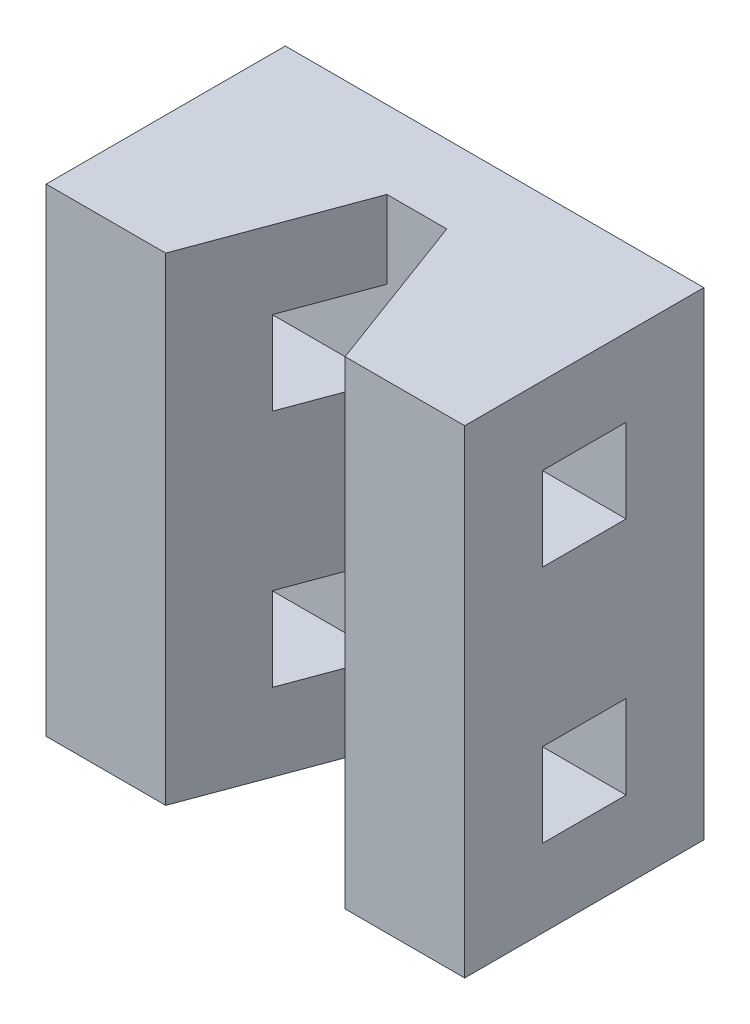
ISO-10303-21;
HEADER;
FILE_DESCRIPTION(('STEP AP214'),'2;1');
FILE_NAME('part.step','',(''),(''),'','','');
FILE_SCHEMA(('AUTOMOTIVE_DESIGN { 1 0 10303 214 1 1 1 1 }'));
ENDSEC;
DATA;
#1=APPLICATION_CONTEXT('core data for automotive mechanical design processes');
#2=APPLICATION_PROTOCOL_DEFINITION('international standard','automotive_design',2000,#1);
#3=PRODUCT_CONTEXT('',#1,'mechanical');
#4=PRODUCT('Part','Part','',(#3));
#5=PRODUCT_RELATED_PRODUCT_CATEGORY('part','',(#4));
#6=PRODUCT_DEFINITION_FORMATION('','',#4);
#7=PRODUCT_DEFINITION_CONTEXT('part definition',#1,'design');
#8=PRODUCT_DEFINITION('design','',#6,#7);
#9=PRODUCT_DEFINITION_SHAPE('','',#8);
#10=(LENGTH_UNIT() NAMED_UNIT(*) SI_UNIT(.MILLI.,.METRE.));
#11=(NAMED_UNIT(*) PLANE_ANGLE_UNIT() SI_UNIT($,.RADIAN.));
#12=(NAMED_UNIT(*) SI_UNIT($,.STERADIAN.) SOLID_ANGLE_UNIT());
#13=UNCERTAINTY_MEASURE_WITH_UNIT(LENGTH_MEASURE(1.E-05),#10,'distance_accuracy_value','');
#14=(GEOMETRIC_REPRESENTATION_CONTEXT(3) GLOBAL_UNCERTAINTY_ASSIGNED_CONTEXT((#13)) GLOBAL_UNIT_ASSIGNED_CONTEXT((#10,
#11,#12)) REPRESENTATION_CONTEXT('',''));
#15=CARTESIAN_POINT('',(0.,0.,0.));
#16=DIRECTION('',(0.,0.,1.));
#17=DIRECTION('',(1.,0.,0.));
#18=AXIS2_PLACEMENT_3D('',#15,#16,#17);
#19=CARTESIAN_POINT('',(-7.,8.,8.));
#20=DIRECTION('',(0.,-1.,0.));
#21=DIRECTION('',(0.,0.,-1.));
#22=AXIS2_PLACEMENT_3D('',#19,#20,#21);
#23=PLANE('',#22);
#24=DIRECTION('',(0.347314355823594,0.,0.937748760723704));
#25=VECTOR('',#24,1.);
#26=CARTESIAN_POINT('',(0.0325693606755091,8.,-0.0120627261761145));
#27=LINE('',#26,#25);
#28=CARTESIAN_POINT('',(0.999999999999997,8.,2.6));
#29=VERTEX_POINT('',#28);
#30=CARTESIAN_POINT('',(3.,8.,8.));
#31=VERTEX_POINT('',#30);
#32=EDGE_CURVE('E217',#29,#31,#27,.T.);
#33=ORIENTED_EDGE('',*,*,#32,.T.);
#34=DIRECTION('',(-1.,0.,0.));
#35=VECTOR('',#34,1.);
#36=CARTESIAN_POINT('',(-7.,8.,8.));
#37=LINE('',#36,#35);
#38=CARTESIAN_POINT('',(7.,8.,8.));
#39=VERTEX_POINT('',#38);
#40=EDGE_CURVE('E339',#39,#31,#37,.T.);
#41=ORIENTED_EDGE('',*,*,#40,.F.);
#42=DIRECTION('',(0.,0.,-1.));
#43=VECTOR('',#42,1.);
#44=CARTESIAN_POINT('',(7.,8.,8.));
#45=LINE('',#44,#43);
#46=CARTESIAN_POINT('',(7.,8.,0.));
#47=VERTEX_POINT('',#46);
#48=EDGE_CURVE('E363',#39,#47,#45,.T.);
#49=ORIENTED_EDGE('',*,*,#48,.T.);
#50=DIRECTION('',(-1.,0.,0.));
#51=VECTOR('',#50,1.);
#52=CARTESIAN_POINT('',(-7.,8.,0.));
#53=LINE('',#52,#51);
#54=CARTESIAN_POINT('',(-7.,8.,0.));
#55=VERTEX_POINT('',#54);
#56=EDGE_CURVE('E350',#47,#55,#53,.T.);
#57=ORIENTED_EDGE('',*,*,#56,.T.);
#58=DIRECTION('',(0.,0.,-1.));
#59=VECTOR('',#58,1.);
#60=CARTESIAN_POINT('',(-7.,8.,8.));
#61=LINE('',#60,#59);
#62=CARTESIAN_POINT('',(-7.,8.,8.));
#63=VERTEX_POINT('',#62);
#64=EDGE_CURVE('E360',#63,#55,#61,.T.);
#65=ORIENTED_EDGE('',*,*,#64,.F.);
#66=CARTESIAN_POINT('',(-3.,8.,8.));
#67=VERTEX_POINT('',#66);
#68=EDGE_CURVE('E337',#67,#63,#37,.T.);
#69=ORIENTED_EDGE('',*,*,#68,.F.);
#70=DIRECTION('',(-0.347314355823594,0.,0.937748760723704));
#71=VECTOR('',#70,1.);
#72=CARTESIAN_POINT('',(-0.0325693606755134,8.,-0.0120627261761161));
#73=LINE('',#72,#71);
#74=CARTESIAN_POINT('',(-1.,8.,2.6));
#75=VERTEX_POINT('',#74);
#76=EDGE_CURVE('E48',#75,#67,#73,.T.);
#77=ORIENTED_EDGE('',*,*,#76,.F.);
#78=DIRECTION('',(1.,0.,0.));
#79=VECTOR('',#78,1.);
#80=CARTESIAN_POINT('',(0.,8.,2.6));
#81=LINE('',#80,#79);
#82=EDGE_CURVE('E223',#75,#29,#81,.T.);
#83=ORIENTED_EDGE('',*,*,#82,.T.);
#84=EDGE_LOOP('',(#33,#41,#49,#57,#65,#69,#77,#83));
#85=FACE_BOUND('',#84,.T.);
#86=ADVANCED_FACE('F33',(#85),#23,.F.);
#87=CARTESIAN_POINT('',(-7.,-8.,8.));
#88=DIRECTION('',(0.,1.,0.));
#89=DIRECTION('',(0.,0.,1.));
#90=AXIS2_PLACEMENT_3D('',#87,#88,#89);
#91=PLANE('',#90);
#92=DIRECTION('',(0.347314355823594,0.,0.937748760723704));
#93=VECTOR('',#92,1.);
#94=CARTESIAN_POINT('',(0.0325693606755091,-8.,-0.0120627261761145));
#95=LINE('',#94,#93);
#96=CARTESIAN_POINT('',(0.999999999999997,-8.,2.6));
#97=VERTEX_POINT('',#96);
#98=CARTESIAN_POINT('',(3.,-8.,8.));
#99=VERTEX_POINT('',#98);
#100=EDGE_CURVE('E212',#97,#99,#95,.T.);
#101=ORIENTED_EDGE('',*,*,#100,.F.);
#102=DIRECTION('',(1.,0.,0.));
#103=VECTOR('',#102,1.);
#104=CARTESIAN_POINT('',(0.,-8.,2.6));
#105=LINE('',#104,#103);
#106=CARTESIAN_POINT('',(-1.,-8.,2.6));
#107=VERTEX_POINT('',#106);
#108=EDGE_CURVE('E197',#107,#97,#105,.T.);
#109=ORIENTED_EDGE('',*,*,#108,.F.);
#110=DIRECTION('',(-0.347314355823594,0.,0.937748760723704));
#111=VECTOR('',#110,1.);
#112=CARTESIAN_POINT('',(-0.0325693606755134,-8.,-0.0120627261761161));
#113=LINE('',#112,#111);
#114=CARTESIAN_POINT('',(-3.,-8.,8.));
#115=VERTEX_POINT('',#114);
#116=EDGE_CURVE('E207',#107,#115,#113,.T.);
#117=ORIENTED_EDGE('',*,*,#116,.T.);
#118=DIRECTION('',(1.,0.,0.));
#119=VECTOR('',#118,1.);
#120=CARTESIAN_POINT('',(-7.,-8.,8.));
#121=LINE('',#120,#119);
#122=CARTESIAN_POINT('',(-7.,-8.,8.));
#123=VERTEX_POINT('',#122);
#124=EDGE_CURVE('E345',#123,#115,#121,.T.);
#125=ORIENTED_EDGE('',*,*,#124,.F.);
#126=DIRECTION('',(0.,0.,-1.));
#127=VECTOR('',#126,1.);
#128=CARTESIAN_POINT('',(-7.,-8.,8.));
#129=LINE('',#128,#127);
#130=CARTESIAN_POINT('',(-7.,-8.,0.));
#131=VERTEX_POINT('',#130);
#132=EDGE_CURVE('E357',#123,#131,#129,.T.);
#133=ORIENTED_EDGE('',*,*,#132,.T.);
#134=DIRECTION('',(1.,0.,0.));
#135=VECTOR('',#134,1.);
#136=CARTESIAN_POINT('',(-7.,-8.,0.));
#137=LINE('',#136,#135);
#138=CARTESIAN_POINT('',(7.,-8.,0.));
#139=VERTEX_POINT('',#138);
#140=EDGE_CURVE('E338',#131,#139,#137,.T.);
#141=ORIENTED_EDGE('',*,*,#140,.T.);
#142=DIRECTION('',(0.,0.,-1.));
#143=VECTOR('',#142,1.);
#144=CARTESIAN_POINT('',(7.,-8.,8.));
#145=LINE('',#144,#143);
#146=CARTESIAN_POINT('',(7.,-8.,8.));
#147=VERTEX_POINT('',#146);
#148=EDGE_CURVE('E347',#147,#139,#145,.T.);
#149=ORIENTED_EDGE('',*,*,#148,.F.);
#150=EDGE_CURVE('E344',#99,#147,#121,.T.);
#151=ORIENTED_EDGE('',*,*,#150,.F.);
#152=EDGE_LOOP('',(#101,#109,#117,#125,#133,#141,#149,#151));
#153=FACE_BOUND('',#152,.T.);
#154=ADVANCED_FACE('F215',(#153),#91,.F.);
#155=CARTESIAN_POINT('',(0.,0.,8.));
#156=DIRECTION('',(0.,0.,1.));
#157=DIRECTION('',(1.,0.,0.));
#158=AXIS2_PLACEMENT_3D('',#155,#156,#157);
#159=PLANE('',#158);
#160=ORIENTED_EDGE('',*,*,#40,.T.);
#161=DIRECTION('',(0.,1.,0.));
#162=VECTOR('',#161,1.);
#163=CARTESIAN_POINT('',(3.,-8.,8.));
#164=LINE('',#163,#162);
#165=EDGE_CURVE('E232',#99,#31,#164,.T.);
#166=ORIENTED_EDGE('',*,*,#165,.F.);
#167=ORIENTED_EDGE('',*,*,#150,.T.);
#168=DIRECTION('',(0.,1.,0.));
#169=VECTOR('',#168,1.);
#170=CARTESIAN_POINT('',(7.,8.,8.));
#171=LINE('',#170,#169);
#172=EDGE_CURVE('E334',#147,#39,#171,.T.);
#173=ORIENTED_EDGE('',*,*,#172,.T.);
#174=EDGE_LOOP('',(#160,#166,#167,#173));
#175=FACE_BOUND('',#174,.T.);
#176=ADVANCED_FACE('F399',(#175),#159,.T.);
#177=CARTESIAN_POINT('',(-7.,2.6,5.4));
#178=DIRECTION('',(0.,-1.,0.));
#179=DIRECTION('',(1.,0.,0.));
#180=AXIS2_PLACEMENT_3D('',#177,#178,#179);
#181=PLANE('',#180);
#182=DIRECTION('',(-0.347314355823594,0.,-0.937748760723704));
#183=VECTOR('',#182,1.);
#184=CARTESIAN_POINT('',(0.946924004825087,2.6,2.45669481302774));
#185=LINE('',#184,#183);
#186=CARTESIAN_POINT('',(2.03703703703703,2.6,5.4));
#187=VERTEX_POINT('',#186);
#188=CARTESIAN_POINT('',(0.999999999999997,2.6,2.6));
#189=VERTEX_POINT('',#188);
#190=EDGE_CURVE('E254',#187,#189,#185,.T.);
#191=ORIENTED_EDGE('',*,*,#190,.F.);
#192=DIRECTION('',(1.,0.,0.));
#193=VECTOR('',#192,1.);
#194=CARTESIAN_POINT('',(-7.,2.6,5.4));
#195=LINE('',#194,#193);
#196=CARTESIAN_POINT('',(7.,2.6,5.4));
#197=VERTEX_POINT('',#196);
#198=EDGE_CURVE('E326',#187,#197,#195,.T.);
#199=ORIENTED_EDGE('',*,*,#198,.T.);
#200=DIRECTION('',(0.,0.,-1.));
#201=VECTOR('',#200,1.);
#202=CARTESIAN_POINT('',(7.,2.6,5.4));
#203=LINE('',#202,#201);
#204=CARTESIAN_POINT('',(7.,2.6,2.6));
#205=VERTEX_POINT('',#204);
#206=EDGE_CURVE('E299',#197,#205,#203,.T.);
#207=ORIENTED_EDGE('',*,*,#206,.T.);
#208=DIRECTION('',(1.,0.,0.));
#209=VECTOR('',#208,1.);
#210=CARTESIAN_POINT('',(-7.,2.6,2.6));
#211=LINE('',#210,#209);
#212=EDGE_CURVE('E322',#189,#205,#211,.T.);
#213=ORIENTED_EDGE('',*,*,#212,.F.);
#214=EDGE_LOOP('',(#191,#199,#207,#213));
#215=FACE_BOUND('',#214,.T.);
#216=ADVANCED_FACE('F422',(#215),#181,.F.);
#217=CARTESIAN_POINT('',(-7.,5.4,5.4));
#218=DIRECTION('',(0.,0.,1.));
#219=DIRECTION('',(1.,0.,0.));
#220=AXIS2_PLACEMENT_3D('',#217,#218,#219);
#221=PLANE('',#220);
#222=DIRECTION('',(0.,-1.,0.));
#223=VECTOR('',#222,1.);
#224=CARTESIAN_POINT('',(2.03703703703703,5.4,5.4));
#225=LINE('',#224,#223);
#226=CARTESIAN_POINT('',(2.03703703703703,5.4,5.4));
#227=VERTEX_POINT('',#226);
#228=EDGE_CURVE('E252',#227,#187,#225,.T.);
#229=ORIENTED_EDGE('',*,*,#228,.F.);
#230=DIRECTION('',(1.,0.,0.));
#231=VECTOR('',#230,1.);
#232=CARTESIAN_POINT('',(-7.,5.4,5.4));
#233=LINE('',#232,#231);
#234=CARTESIAN_POINT('',(7.,5.4,5.4));
#235=VERTEX_POINT('',#234);
#236=EDGE_CURVE('E330',#227,#235,#233,.T.);
#237=ORIENTED_EDGE('',*,*,#236,.T.);
#238=DIRECTION('',(0.,-1.,0.));
#239=VECTOR('',#238,1.);
#240=CARTESIAN_POINT('',(7.,5.4,5.4));
#241=LINE('',#240,#239);
#242=EDGE_CURVE('E314',#235,#197,#241,.T.);
#243=ORIENTED_EDGE('',*,*,#242,.T.);
#244=ORIENTED_EDGE('',*,*,#198,.F.);
#245=EDGE_LOOP('',(#229,#237,#243,#244));
#246=FACE_BOUND('',#245,.T.);
#247=ADVANCED_FACE('F438',(#246),#221,.F.);
#248=CARTESIAN_POINT('',(-7.,5.4,5.4));
#249=DIRECTION('',(0.,1.,0.));
#250=DIRECTION('',(0.,0.,1.));
#251=AXIS2_PLACEMENT_3D('',#248,#249,#250);
#252=PLANE('',#251);
#253=DIRECTION('',(0.347314355823594,0.,0.937748760723704));
#254=VECTOR('',#253,1.);
#255=CARTESIAN_POINT('',(0.946924004825086,5.4,2.45669481302774));
#256=LINE('',#255,#254);
#257=CARTESIAN_POINT('',(0.999999999999997,5.4,2.6));
#258=VERTEX_POINT('',#257);
#259=EDGE_CURVE('E250',#258,#227,#256,.T.);
#260=ORIENTED_EDGE('',*,*,#259,.F.);
#261=DIRECTION('',(1.,0.,0.));
#262=VECTOR('',#261,1.);
#263=CARTESIAN_POINT('',(-7.,5.4,2.6));
#264=LINE('',#263,#262);
#265=CARTESIAN_POINT('',(7.,5.4,2.6));
#266=VERTEX_POINT('',#265);
#267=EDGE_CURVE('E308',#258,#266,#264,.T.);
#268=ORIENTED_EDGE('',*,*,#267,.T.);
#269=DIRECTION('',(0.,0.,1.));
#270=VECTOR('',#269,1.);
#271=CARTESIAN_POINT('',(7.,5.4,5.4));
#272=LINE('',#271,#270);
#273=EDGE_CURVE('E311',#266,#235,#272,.T.);
#274=ORIENTED_EDGE('',*,*,#273,.T.);
#275=ORIENTED_EDGE('',*,*,#236,.F.);
#276=EDGE_LOOP('',(#260,#268,#274,#275));
#277=FACE_BOUND('',#276,.T.);
#278=ADVANCED_FACE('F434',(#277),#252,.F.);
#279=CARTESIAN_POINT('',(-7.,-5.4,5.4));
#280=DIRECTION('',(0.,0.,1.));
#281=DIRECTION('',(1.,0.,0.));
#282=AXIS2_PLACEMENT_3D('',#279,#280,#281);
#283=PLANE('',#282);
#284=DIRECTION('',(0.,-1.,0.));
#285=VECTOR('',#284,1.);
#286=CARTESIAN_POINT('',(2.03703703703703,-5.4,5.4));
#287=LINE('',#286,#285);
#288=CARTESIAN_POINT('',(2.03703703703703,-2.6,5.4));
#289=VERTEX_POINT('',#288);
#290=CARTESIAN_POINT('',(2.03703703703703,-5.4,5.4));
#291=VERTEX_POINT('',#290);
#292=EDGE_CURVE('E246',#289,#291,#287,.T.);
#293=ORIENTED_EDGE('',*,*,#292,.F.);
#294=DIRECTION('',(1.,0.,0.));
#295=VECTOR('',#294,1.);
#296=CARTESIAN_POINT('',(-7.,-2.6,5.4));
#297=LINE('',#296,#295);
#298=CARTESIAN_POINT('',(7.,-2.6,5.4));
#299=VERTEX_POINT('',#298);
#300=EDGE_CURVE('E285',#289,#299,#297,.T.);
#301=ORIENTED_EDGE('',*,*,#300,.T.);
#302=DIRECTION('',(0.,-1.,0.));
#303=VECTOR('',#302,1.);
#304=CARTESIAN_POINT('',(7.,-5.4,5.4));
#305=LINE('',#304,#303);
#306=CARTESIAN_POINT('',(7.,-5.4,5.4));
#307=VERTEX_POINT('',#306);
#308=EDGE_CURVE('E256',#299,#307,#305,.T.);
#309=ORIENTED_EDGE('',*,*,#308,.T.);
#310=DIRECTION('',(1.,0.,0.));
#311=VECTOR('',#310,1.);
#312=CARTESIAN_POINT('',(-7.,-5.4,5.4));
#313=LINE('',#312,#311);
#314=EDGE_CURVE('E270',#291,#307,#313,.T.);
#315=ORIENTED_EDGE('',*,*,#314,.F.);
#316=EDGE_LOOP('',(#293,#301,#309,#315));
#317=FACE_BOUND('',#316,.T.);
#318=ADVANCED_FACE('F444',(#317),#283,.F.);
#319=CARTESIAN_POINT('',(-7.,-2.6,5.4));
#320=DIRECTION('',(0.,1.,0.));
#321=DIRECTION('',(-1.,0.,0.));
#322=AXIS2_PLACEMENT_3D('',#319,#320,#321);
#323=PLANE('',#322);
#324=DIRECTION('',(0.347314355823594,0.,0.937748760723704));
#325=VECTOR('',#324,1.);
#326=CARTESIAN_POINT('',(0.946924004825087,-2.6,2.45669481302774));
#327=LINE('',#326,#325);
#328=CARTESIAN_POINT('',(0.999999999999997,-2.6,2.6));
#329=VERTEX_POINT('',#328);
#330=EDGE_CURVE('E248',#329,#289,#327,.T.);
#331=ORIENTED_EDGE('',*,*,#330,.F.);
#332=DIRECTION('',(1.,0.,0.));
#333=VECTOR('',#332,1.);
#334=CARTESIAN_POINT('',(-7.,-2.6,2.6));
#335=LINE('',#334,#333);
#336=CARTESIAN_POINT('',(7.,-2.6,2.6));
#337=VERTEX_POINT('',#336);
#338=EDGE_CURVE('E289',#329,#337,#335,.T.);
#339=ORIENTED_EDGE('',*,*,#338,.T.);
#340=DIRECTION('',(0.,0.,1.));
#341=VECTOR('',#340,1.);
#342=CARTESIAN_POINT('',(7.,-2.6,5.4));
#343=LINE('',#342,#341);
#344=EDGE_CURVE('E261',#337,#299,#343,.T.);
#345=ORIENTED_EDGE('',*,*,#344,.T.);
#346=ORIENTED_EDGE('',*,*,#300,.F.);
#347=EDGE_LOOP('',(#331,#339,#345,#346));
#348=FACE_BOUND('',#347,.T.);
#349=ADVANCED_FACE('F449',(#348),#323,.F.);
#350=CARTESIAN_POINT('',(-7.,-5.4,5.4));
#351=DIRECTION('',(0.,-1.,0.));
#352=DIRECTION('',(0.,0.,-1.));
#353=AXIS2_PLACEMENT_3D('',#350,#351,#352);
#354=PLANE('',#353);
#355=DIRECTION('',(-0.347314355823594,0.,-0.937748760723704));
#356=VECTOR('',#355,1.);
#357=CARTESIAN_POINT('',(0.946924004825086,-5.4,2.45669481302774));
#358=LINE('',#357,#356);
#359=CARTESIAN_POINT('',(0.999999999999997,-5.4,2.6));
#360=VERTEX_POINT('',#359);
#361=EDGE_CURVE('E11',#291,#360,#358,.T.);
#362=ORIENTED_EDGE('',*,*,#361,.F.);
#363=ORIENTED_EDGE('',*,*,#314,.T.);
#364=DIRECTION('',(0.,0.,-1.));
#365=VECTOR('',#364,1.);
#366=CARTESIAN_POINT('',(7.,-5.4,5.4));
#367=LINE('',#366,#365);
#368=CARTESIAN_POINT('',(7.,-5.4,2.6));
#369=VERTEX_POINT('',#368);
#370=EDGE_CURVE('E273',#307,#369,#367,.T.);
#371=ORIENTED_EDGE('',*,*,#370,.T.);
#372=DIRECTION('',(1.,0.,0.));
#373=VECTOR('',#372,1.);
#374=CARTESIAN_POINT('',(-7.,-5.4,2.6));
#375=LINE('',#374,#373);
#376=EDGE_CURVE('E291',#360,#369,#375,.T.);
#377=ORIENTED_EDGE('',*,*,#376,.F.);
#378=EDGE_LOOP('',(#362,#363,#371,#377));
#379=FACE_BOUND('',#378,.T.);
#380=ADVANCED_FACE('F411',(#379),#354,.F.);
#381=CARTESIAN_POINT('',(7.,8.,8.));
#382=DIRECTION('',(-1.,0.,0.));
#383=DIRECTION('',(0.,-1.,0.));
#384=AXIS2_PLACEMENT_3D('',#381,#382,#383);
#385=PLANE('',#384);
#386=ORIENTED_EDGE('',*,*,#370,.F.);
#387=ORIENTED_EDGE('',*,*,#308,.F.);
#388=ORIENTED_EDGE('',*,*,#344,.F.);
#389=DIRECTION('',(0.,1.,0.));
#390=VECTOR('',#389,1.);
#391=CARTESIAN_POINT('',(7.,-5.4,2.6));
#392=LINE('',#391,#390);
#393=EDGE_CURVE('E276',#369,#337,#392,.T.);
#394=ORIENTED_EDGE('',*,*,#393,.F.);
#395=EDGE_LOOP('',(#386,#387,#388,#394));
#396=FACE_BOUND('',#395,.T.);
#397=ORIENTED_EDGE('',*,*,#273,.F.);
#398=DIRECTION('',(0.,1.,0.));
#399=VECTOR('',#398,1.);
#400=CARTESIAN_POINT('',(7.,5.4,2.6));
#401=LINE('',#400,#399);
#402=EDGE_CURVE('E284',#205,#266,#401,.T.);
#403=ORIENTED_EDGE('',*,*,#402,.F.);
#404=ORIENTED_EDGE('',*,*,#206,.F.);
#405=ORIENTED_EDGE('',*,*,#242,.F.);
#406=EDGE_LOOP('',(#397,#403,#404,#405));
#407=FACE_BOUND('',#406,.T.);
#408=DIRECTION('',(0.,1.,0.));
#409=VECTOR('',#408,1.);
#410=CARTESIAN_POINT('',(7.,8.,0.));
#411=LINE('',#410,#409);
#412=EDGE_CURVE('E321',#139,#47,#411,.T.);
#413=ORIENTED_EDGE('',*,*,#412,.T.);
#414=ORIENTED_EDGE('',*,*,#48,.F.);
#415=ORIENTED_EDGE('',*,*,#172,.F.);
#416=ORIENTED_EDGE('',*,*,#148,.T.);
#417=EDGE_LOOP('',(#413,#414,#415,#416));
#418=FACE_BOUND('',#417,.T.);
#419=ADVANCED_FACE('F35',(#396,#407,#418),#385,.F.);
#420=CARTESIAN_POINT('',(-7.,8.,8.));
#421=DIRECTION('',(1.,0.,0.));
#422=DIRECTION('',(0.,1.,0.));
#423=AXIS2_PLACEMENT_3D('',#420,#421,#422);
#424=PLANE('',#423);
#425=DIRECTION('',(0.,0.,1.));
#426=VECTOR('',#425,1.);
#427=CARTESIAN_POINT('',(-7.,-2.6,5.4));
#428=LINE('',#427,#426);
#429=CARTESIAN_POINT('',(-7.,-2.6,2.6));
#430=VERTEX_POINT('',#429);
#431=CARTESIAN_POINT('',(-7.,-2.6,5.4));
#432=VERTEX_POINT('',#431);
#433=EDGE_CURVE('E267',#430,#432,#428,.T.);
#434=ORIENTED_EDGE('',*,*,#433,.T.);
#435=DIRECTION('',(0.,-1.,0.));
#436=VECTOR('',#435,1.);
#437=CARTESIAN_POINT('',(-7.,-5.4,5.4));
#438=LINE('',#437,#436);
#439=CARTESIAN_POINT('',(-7.,-5.4,5.4));
#440=VERTEX_POINT('',#439);
#441=EDGE_CURVE('E257',#432,#440,#438,.T.);
#442=ORIENTED_EDGE('',*,*,#441,.T.);
#443=DIRECTION('',(0.,0.,-1.));
#444=VECTOR('',#443,1.);
#445=CARTESIAN_POINT('',(-7.,-5.4,5.4));
#446=LINE('',#445,#444);
#447=CARTESIAN_POINT('',(-7.,-5.4,2.6));
#448=VERTEX_POINT('',#447);
#449=EDGE_CURVE('E260',#440,#448,#446,.T.);
#450=ORIENTED_EDGE('',*,*,#449,.T.);
#451=DIRECTION('',(0.,1.,0.));
#452=VECTOR('',#451,1.);
#453=CARTESIAN_POINT('',(-7.,-5.4,2.6));
#454=LINE('',#453,#452);
#455=EDGE_CURVE('E264',#448,#430,#454,.T.);
#456=ORIENTED_EDGE('',*,*,#455,.T.);
#457=EDGE_LOOP('',(#434,#442,#450,#456));
#458=FACE_BOUND('',#457,.T.);
#459=DIRECTION('',(0.,0.,-1.));
#460=VECTOR('',#459,1.);
#461=CARTESIAN_POINT('',(-7.,2.6,5.4));
#462=LINE('',#461,#460);
#463=CARTESIAN_POINT('',(-7.,2.6,5.4));
#464=VERTEX_POINT('',#463);
#465=CARTESIAN_POINT('',(-7.,2.6,2.6));
#466=VERTEX_POINT('',#465);
#467=EDGE_CURVE('E305',#464,#466,#462,.T.);
#468=ORIENTED_EDGE('',*,*,#467,.T.);
#469=DIRECTION('',(0.,1.,0.));
#470=VECTOR('',#469,1.);
#471=CARTESIAN_POINT('',(-7.,5.4,2.6));
#472=LINE('',#471,#470);
#473=CARTESIAN_POINT('',(-7.,5.4,2.6));
#474=VERTEX_POINT('',#473);
#475=EDGE_CURVE('E295',#466,#474,#472,.T.);
#476=ORIENTED_EDGE('',*,*,#475,.T.);
#477=DIRECTION('',(0.,0.,1.));
#478=VECTOR('',#477,1.);
#479=CARTESIAN_POINT('',(-7.,5.4,5.4));
#480=LINE('',#479,#478);
#481=CARTESIAN_POINT('',(-7.,5.4,5.4));
#482=VERTEX_POINT('',#481);
#483=EDGE_CURVE('E298',#474,#482,#480,.T.);
#484=ORIENTED_EDGE('',*,*,#483,.T.);
#485=DIRECTION('',(0.,-1.,0.));
#486=VECTOR('',#485,1.);
#487=CARTESIAN_POINT('',(-7.,5.4,5.4));
#488=LINE('',#487,#486);
#489=EDGE_CURVE('E302',#482,#464,#488,.T.);
#490=ORIENTED_EDGE('',*,*,#489,.T.);
#491=EDGE_LOOP('',(#468,#476,#484,#490));
#492=FACE_BOUND('',#491,.T.);
#493=DIRECTION('',(0.,-1.,0.));
#494=VECTOR('',#493,1.);
#495=CARTESIAN_POINT('',(-7.,8.,0.));
#496=LINE('',#495,#494);
#497=EDGE_CURVE('E352',#55,#131,#496,.T.);
#498=ORIENTED_EDGE('',*,*,#497,.T.);
#499=ORIENTED_EDGE('',*,*,#132,.F.);
#500=DIRECTION('',(0.,-1.,0.));
#501=VECTOR('',#500,1.);
#502=CARTESIAN_POINT('',(-7.,8.,8.));
#503=LINE('',#502,#501);
#504=EDGE_CURVE('E342',#63,#123,#503,.T.);
#505=ORIENTED_EDGE('',*,*,#504,.F.);
#506=ORIENTED_EDGE('',*,*,#64,.T.);
#507=EDGE_LOOP('',(#498,#499,#505,#506));
#508=FACE_BOUND('',#507,.T.);
#509=ADVANCED_FACE('F402',(#458,#492,#508),#424,.F.);
#510=DIRECTION('',(0.,1.,0.));
#511=VECTOR('',#510,1.);
#512=CARTESIAN_POINT('',(-3.,-8.,8.));
#513=LINE('',#512,#511);
#514=EDGE_CURVE('E202',#115,#67,#513,.T.);
#515=ORIENTED_EDGE('',*,*,#514,.T.);
#516=ORIENTED_EDGE('',*,*,#68,.T.);
#517=ORIENTED_EDGE('',*,*,#504,.T.);
#518=ORIENTED_EDGE('',*,*,#124,.T.);
#519=EDGE_LOOP('',(#515,#516,#517,#518));
#520=FACE_BOUND('',#519,.T.);
#521=ADVANCED_FACE('F385',(#520),#159,.T.);
#522=CARTESIAN_POINT('',(0.,0.,0.));
#523=DIRECTION('',(0.,0.,1.));
#524=DIRECTION('',(1.,0.,0.));
#525=AXIS2_PLACEMENT_3D('',#522,#523,#524);
#526=PLANE('',#525);
#527=ORIENTED_EDGE('',*,*,#412,.F.);
#528=ORIENTED_EDGE('',*,*,#140,.F.);
#529=ORIENTED_EDGE('',*,*,#497,.F.);
#530=ORIENTED_EDGE('',*,*,#56,.F.);
#531=EDGE_LOOP('',(#527,#528,#529,#530));
#532=FACE_BOUND('',#531,.T.);
#533=ADVANCED_FACE('F393',(#532),#526,.F.);
#534=CARTESIAN_POINT('',(-7.,5.4,2.6));
#535=DIRECTION('',(0.,0.,-1.));
#536=DIRECTION('',(0.,1.,0.));
#537=AXIS2_PLACEMENT_3D('',#534,#535,#536);
#538=PLANE('',#537);
#539=CARTESIAN_POINT('',(-1.,2.6,2.6));
#540=VERTEX_POINT('',#539);
#541=EDGE_CURVE('E319',#466,#540,#211,.T.);
#542=ORIENTED_EDGE('',*,*,#541,.T.);
#543=DIRECTION('',(0.,1.,0.));
#544=VECTOR('',#543,1.);
#545=CARTESIAN_POINT('',(-1.,-8.,2.6));
#546=LINE('',#545,#544);
#547=CARTESIAN_POINT('',(-1.,-2.6,2.6));
#548=VERTEX_POINT('',#547);
#549=EDGE_CURVE('E203',#548,#540,#546,.T.);
#550=ORIENTED_EDGE('',*,*,#549,.F.);
#551=EDGE_CURVE('E286',#430,#548,#335,.T.);
#552=ORIENTED_EDGE('',*,*,#551,.F.);
#553=ORIENTED_EDGE('',*,*,#455,.F.);
#554=CARTESIAN_POINT('',(-1.,-5.4,2.6));
#555=VERTEX_POINT('',#554);
#556=EDGE_CURVE('E200',#448,#555,#375,.T.);
#557=ORIENTED_EDGE('',*,*,#556,.T.);
#558=EDGE_CURVE('E191',#107,#555,#546,.T.);
#559=ORIENTED_EDGE('',*,*,#558,.F.);
#560=ORIENTED_EDGE('',*,*,#108,.T.);
#561=DIRECTION('',(0.,1.,0.));
#562=VECTOR('',#561,1.);
#563=CARTESIAN_POINT('',(0.999999999999997,-8.,2.6));
#564=LINE('',#563,#562);
#565=EDGE_CURVE('E227',#97,#360,#564,.T.);
#566=ORIENTED_EDGE('',*,*,#565,.T.);
#567=ORIENTED_EDGE('',*,*,#376,.T.);
#568=ORIENTED_EDGE('',*,*,#393,.T.);
#569=ORIENTED_EDGE('',*,*,#338,.F.);
#570=EDGE_CURVE('E230',#329,#189,#564,.T.);
#571=ORIENTED_EDGE('',*,*,#570,.T.);
#572=ORIENTED_EDGE('',*,*,#212,.T.);
#573=ORIENTED_EDGE('',*,*,#402,.T.);
#574=ORIENTED_EDGE('',*,*,#267,.F.);
#575=EDGE_CURVE('E231',#258,#29,#564,.T.);
#576=ORIENTED_EDGE('',*,*,#575,.T.);
#577=ORIENTED_EDGE('',*,*,#82,.F.);
#578=CARTESIAN_POINT('',(-1.,5.4,2.6));
#579=VERTEX_POINT('',#578);
#580=EDGE_CURVE('E205',#579,#75,#546,.T.);
#581=ORIENTED_EDGE('',*,*,#580,.F.);
#582=EDGE_CURVE('E331',#474,#579,#264,.T.);
#583=ORIENTED_EDGE('',*,*,#582,.F.);
#584=ORIENTED_EDGE('',*,*,#475,.F.);
#585=EDGE_LOOP('',(#542,#550,#552,#553,#557,#559,#560,#566,#567,#568,#569,#571,#572,#573,#574,
#576,#577,#581,#583,#584));
#586=FACE_BOUND('',#585,.T.);
#587=ADVANCED_FACE('F194',(#586),#538,.F.);
#588=CARTESIAN_POINT('',(-2.03703703703704,2.6,5.4));
#589=VERTEX_POINT('',#588);
#590=EDGE_CURVE('E323',#464,#589,#195,.T.);
#591=ORIENTED_EDGE('',*,*,#590,.T.);
#592=DIRECTION('',(0.347314355823594,0.,-0.937748760723704));
#593=VECTOR('',#592,1.);
#594=CARTESIAN_POINT('',(-2.63570566948131,2.6,7.01640530759952));
#595=LINE('',#594,#593);
#596=EDGE_CURVE('E243',#589,#540,#595,.T.);
#597=ORIENTED_EDGE('',*,*,#596,.T.);
#598=ORIENTED_EDGE('',*,*,#541,.F.);
#599=ORIENTED_EDGE('',*,*,#467,.F.);
#600=EDGE_LOOP('',(#591,#597,#598,#599));
#601=FACE_BOUND('',#600,.T.);
#602=ADVANCED_FACE('F428',(#601),#181,.F.);
#603=CARTESIAN_POINT('',(-2.03703703703704,5.4,5.4));
#604=VERTEX_POINT('',#603);
#605=EDGE_CURVE('E327',#482,#604,#233,.T.);
#606=ORIENTED_EDGE('',*,*,#605,.T.);
#607=DIRECTION('',(0.,-1.,0.));
#608=VECTOR('',#607,1.);
#609=CARTESIAN_POINT('',(-2.03703703703704,5.4,5.4));
#610=LINE('',#609,#608);
#611=EDGE_CURVE('E55',#604,#589,#610,.T.);
#612=ORIENTED_EDGE('',*,*,#611,.T.);
#613=ORIENTED_EDGE('',*,*,#590,.F.);
#614=ORIENTED_EDGE('',*,*,#489,.F.);
#615=EDGE_LOOP('',(#606,#612,#613,#614));
#616=FACE_BOUND('',#615,.T.);
#617=ADVANCED_FACE('F432',(#616),#221,.F.);
#618=ORIENTED_EDGE('',*,*,#582,.T.);
#619=DIRECTION('',(-0.347314355823594,0.,0.937748760723704));
#620=VECTOR('',#619,1.);
#621=CARTESIAN_POINT('',(-2.63570566948131,5.4,7.01640530759952));
#622=LINE('',#621,#620);
#623=EDGE_CURVE('E240',#579,#604,#622,.T.);
#624=ORIENTED_EDGE('',*,*,#623,.T.);
#625=ORIENTED_EDGE('',*,*,#605,.F.);
#626=ORIENTED_EDGE('',*,*,#483,.F.);
#627=EDGE_LOOP('',(#618,#624,#625,#626));
#628=FACE_BOUND('',#627,.T.);
#629=ADVANCED_FACE('F429',(#628),#252,.F.);
#630=CARTESIAN_POINT('',(-2.03703703703704,-2.6,5.4));
#631=VERTEX_POINT('',#630);
#632=EDGE_CURVE('E281',#432,#631,#297,.T.);
#633=ORIENTED_EDGE('',*,*,#632,.T.);
#634=DIRECTION('',(0.,-1.,0.));
#635=VECTOR('',#634,1.);
#636=CARTESIAN_POINT('',(-2.03703703703704,-5.4,5.4));
#637=LINE('',#636,#635);
#638=CARTESIAN_POINT('',(-2.03703703703704,-5.4,5.4));
#639=VERTEX_POINT('',#638);
#640=EDGE_CURVE('E229',#631,#639,#637,.T.);
#641=ORIENTED_EDGE('',*,*,#640,.T.);
#642=EDGE_CURVE('E292',#440,#639,#313,.T.);
#643=ORIENTED_EDGE('',*,*,#642,.F.);
#644=ORIENTED_EDGE('',*,*,#441,.F.);
#645=EDGE_LOOP('',(#633,#641,#643,#644));
#646=FACE_BOUND('',#645,.T.);
#647=ADVANCED_FACE('F369',(#646),#283,.F.);
#648=ORIENTED_EDGE('',*,*,#551,.T.);
#649=DIRECTION('',(-0.347314355823594,0.,0.937748760723704));
#650=VECTOR('',#649,1.);
#651=CARTESIAN_POINT('',(-2.63570566948131,-2.6,7.01640530759952));
#652=LINE('',#651,#650);
#653=EDGE_CURVE('E237',#548,#631,#652,.T.);
#654=ORIENTED_EDGE('',*,*,#653,.T.);
#655=ORIENTED_EDGE('',*,*,#632,.F.);
#656=ORIENTED_EDGE('',*,*,#433,.F.);
#657=EDGE_LOOP('',(#648,#654,#655,#656));
#658=FACE_BOUND('',#657,.T.);
#659=ADVANCED_FACE('F373',(#658),#323,.F.);
#660=ORIENTED_EDGE('',*,*,#642,.T.);
#661=DIRECTION('',(0.347314355823594,0.,-0.937748760723704));
#662=VECTOR('',#661,1.);
#663=CARTESIAN_POINT('',(-2.63570566948131,-5.4,7.01640530759952));
#664=LINE('',#663,#662);
#665=EDGE_CURVE('E41',#639,#555,#664,.T.);
#666=ORIENTED_EDGE('',*,*,#665,.T.);
#667=ORIENTED_EDGE('',*,*,#556,.F.);
#668=ORIENTED_EDGE('',*,*,#449,.F.);
#669=EDGE_LOOP('',(#660,#666,#667,#668));
#670=FACE_BOUND('',#669,.T.);
#671=ADVANCED_FACE('F366',(#670),#354,.F.);
#672=CARTESIAN_POINT('',(0.0325693606755091,-8.,-0.0120627261761145));
#673=DIRECTION('',(-0.937748760723704,0.,0.347314355823594));
#674=DIRECTION('',(0.347314355823594,0.,0.937748760723704));
#675=AXIS2_PLACEMENT_3D('',#672,#673,#674);
#676=PLANE('',#675);
#677=ORIENTED_EDGE('',*,*,#190,.T.);
#678=ORIENTED_EDGE('',*,*,#570,.F.);
#679=ORIENTED_EDGE('',*,*,#330,.T.);
#680=ORIENTED_EDGE('',*,*,#292,.T.);
#681=ORIENTED_EDGE('',*,*,#361,.T.);
#682=ORIENTED_EDGE('',*,*,#565,.F.);
#683=ORIENTED_EDGE('',*,*,#100,.T.);
#684=ORIENTED_EDGE('',*,*,#165,.T.);
#685=ORIENTED_EDGE('',*,*,#32,.F.);
#686=ORIENTED_EDGE('',*,*,#575,.F.);
#687=ORIENTED_EDGE('',*,*,#259,.T.);
#688=ORIENTED_EDGE('',*,*,#228,.T.);
#689=EDGE_LOOP('',(#677,#678,#679,#680,#681,#682,#683,#684,#685,#686,#687,#688));
#690=FACE_BOUND('',#689,.T.);
#691=ADVANCED_FACE('F401',(#690),#676,.T.);
#692=CARTESIAN_POINT('',(-0.0325693606755134,-8.,-0.0120627261761161));
#693=DIRECTION('',(-0.937748760723704,0.,-0.347314355823594));
#694=DIRECTION('',(-0.347314355823594,0.,0.937748760723704));
#695=AXIS2_PLACEMENT_3D('',#692,#693,#694);
#696=PLANE('',#695);
#697=ORIENTED_EDGE('',*,*,#611,.F.);
#698=ORIENTED_EDGE('',*,*,#623,.F.);
#699=ORIENTED_EDGE('',*,*,#580,.T.);
#700=ORIENTED_EDGE('',*,*,#76,.T.);
#701=ORIENTED_EDGE('',*,*,#514,.F.);
#702=ORIENTED_EDGE('',*,*,#116,.F.);
#703=ORIENTED_EDGE('',*,*,#558,.T.);
#704=ORIENTED_EDGE('',*,*,#665,.F.);
#705=ORIENTED_EDGE('',*,*,#640,.F.);
#706=ORIENTED_EDGE('',*,*,#653,.F.);
#707=ORIENTED_EDGE('',*,*,#549,.T.);
#708=ORIENTED_EDGE('',*,*,#596,.F.);
#709=EDGE_LOOP('',(#697,#698,#699,#700,#701,#702,#703,#704,#705,#706,#707,#708));
#710=FACE_BOUND('',#709,.T.);
#711=ADVANCED_FACE('F208',(#710),#696,.F.);
#712=CLOSED_SHELL('',(#86,#154,#176,#216,#247,#278,#318,#349,#380,#419,#509,#521,#533,#587,#602,
#617,#629,#647,#659,#671,#691,#711));
#713=MANIFOLD_SOLID_BREP('B2',#712);
#714=ADVANCED_BREP_SHAPE_REPRESENTATION('',(#18,#713),#14);
#715=SHAPE_DEFINITION_REPRESENTATION(#9,#714);
ENDSEC;
END-ISO-10303-21;
